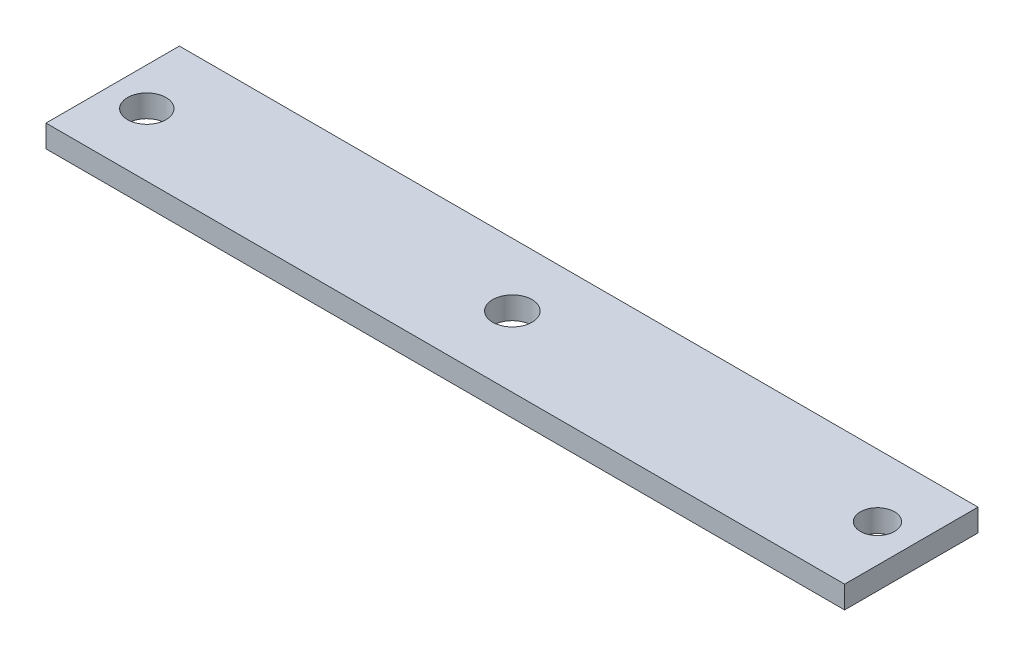
ISO-10303-21;
HEADER;
FILE_DESCRIPTION(('STEP AP214'),'2;1');
FILE_NAME('part.step','',(''),(''),'','','');
FILE_SCHEMA(('AUTOMOTIVE_DESIGN { 1 0 10303 214 1 1 1 1 }'));
ENDSEC;
DATA;
#1=APPLICATION_CONTEXT('core data for automotive mechanical design processes');
#2=APPLICATION_PROTOCOL_DEFINITION('international standard','automotive_design',2000,#1);
#3=PRODUCT_CONTEXT('',#1,'mechanical');
#4=PRODUCT('Part','Part','',(#3));
#5=PRODUCT_RELATED_PRODUCT_CATEGORY('part','',(#4));
#6=PRODUCT_DEFINITION_FORMATION('','',#4);
#7=PRODUCT_DEFINITION_CONTEXT('part definition',#1,'design');
#8=PRODUCT_DEFINITION('design','',#6,#7);
#9=PRODUCT_DEFINITION_SHAPE('','',#8);
#10=(LENGTH_UNIT() NAMED_UNIT(*) SI_UNIT(.MILLI.,.METRE.));
#11=(NAMED_UNIT(*) PLANE_ANGLE_UNIT() SI_UNIT($,.RADIAN.));
#12=(NAMED_UNIT(*) SI_UNIT($,.STERADIAN.) SOLID_ANGLE_UNIT());
#13=UNCERTAINTY_MEASURE_WITH_UNIT(LENGTH_MEASURE(1.E-05),#10,'distance_accuracy_value','');
#14=(GEOMETRIC_REPRESENTATION_CONTEXT(3) GLOBAL_UNCERTAINTY_ASSIGNED_CONTEXT((#13)) GLOBAL_UNIT_ASSIGNED_CONTEXT((#10,
#11,#12)) REPRESENTATION_CONTEXT('',''));
#15=CARTESIAN_POINT('',(0.,0.,0.));
#16=DIRECTION('',(0.,0.,1.));
#17=DIRECTION('',(1.,0.,0.));
#18=AXIS2_PLACEMENT_3D('',#15,#16,#17);
#19=CARTESIAN_POINT('',(0.,2.6,0.));
#20=DIRECTION('',(0.,1.,0.));
#21=DIRECTION('',(0.,0.,1.));
#22=AXIS2_PLACEMENT_3D('',#19,#20,#21);
#23=PLANE('',#22);
#24=CARTESIAN_POINT('',(12.6319444444444,2.6,-1.57020833333333));
#25=DIRECTION('',(0.,1.,0.));
#26=DIRECTION('',(0.,0.,1.));
#27=AXIS2_PLACEMENT_3D('',#24,#25,#26);
#28=CIRCLE('',#27,2.285);
#29=CARTESIAN_POINT('',(12.6319444444444,2.6,0.714791666666672));
#30=VERTEX_POINT('',#29);
#31=EDGE_CURVE('E114',#30,#30,#28,.T.);
#32=ORIENTED_EDGE('',*,*,#31,.F.);
#33=EDGE_LOOP('',(#32));
#34=FACE_BOUND('',#33,.T.);
#35=DIRECTION('',(0.,0.,1.));
#36=VECTOR('',#35,1.);
#37=CARTESIAN_POINT('',(-33.3680555555556,2.6,-8.88020833333333));
#38=LINE('',#37,#36);
#39=CARTESIAN_POINT('',(-33.3680555555556,2.6,-8.88020833333333));
#40=VERTEX_POINT('',#39);
#41=CARTESIAN_POINT('',(-33.3680555555556,2.6,6.61979166666667));
#42=VERTEX_POINT('',#41);
#43=EDGE_CURVE('E84',#40,#42,#38,.T.);
#44=ORIENTED_EDGE('',*,*,#43,.T.);
#45=DIRECTION('',(1.,0.,0.));
#46=VECTOR('',#45,1.);
#47=CARTESIAN_POINT('',(-33.3680555555556,2.6,6.61979166666667));
#48=LINE('',#47,#46);
#49=CARTESIAN_POINT('',(59.4319444444444,2.6,6.61979166666667));
#50=VERTEX_POINT('',#49);
#51=EDGE_CURVE('E79',#42,#50,#48,.T.);
#52=ORIENTED_EDGE('',*,*,#51,.T.);
#53=DIRECTION('',(0.,0.,-1.));
#54=VECTOR('',#53,1.);
#55=CARTESIAN_POINT('',(59.4319444444444,2.6,-8.88020833333333));
#56=LINE('',#55,#54);
#57=CARTESIAN_POINT('',(59.4319444444444,2.6,-8.88020833333333));
#58=VERTEX_POINT('',#57);
#59=EDGE_CURVE('E82',#50,#58,#56,.T.);
#60=ORIENTED_EDGE('',*,*,#59,.T.);
#61=DIRECTION('',(-1.,0.,0.));
#62=VECTOR('',#61,1.);
#63=CARTESIAN_POINT('',(-33.3680555555556,2.6,-8.88020833333333));
#64=LINE('',#63,#62);
#65=EDGE_CURVE('E49',#58,#40,#64,.T.);
#66=ORIENTED_EDGE('',*,*,#65,.T.);
#67=EDGE_LOOP('',(#44,#52,#60,#66));
#68=FACE_BOUND('',#67,.T.);
#69=CARTESIAN_POINT('',(-28.9680555555556,2.6,-0.690208333333329));
#70=DIRECTION('',(0.,1.,0.));
#71=DIRECTION('',(0.,0.,1.));
#72=AXIS2_PLACEMENT_3D('',#69,#70,#71);
#73=CIRCLE('',#72,2.2355);
#74=CARTESIAN_POINT('',(-28.9680555555556,2.6,1.54529166666667));
#75=VERTEX_POINT('',#74);
#76=EDGE_CURVE('E99',#75,#75,#73,.T.);
#77=ORIENTED_EDGE('',*,*,#76,.F.);
#78=EDGE_LOOP('',(#77));
#79=FACE_BOUND('',#78,.T.);
#80=CARTESIAN_POINT('',(55.0519444444444,2.6,-1.58020833333333));
#81=DIRECTION('',(0.,1.,0.));
#82=DIRECTION('',(0.,0.,1.));
#83=AXIS2_PLACEMENT_3D('',#80,#81,#82);
#84=CIRCLE('',#83,1.985);
#85=CARTESIAN_POINT('',(55.0519444444444,2.6,0.404791666666673));
#86=VERTEX_POINT('',#85);
#87=EDGE_CURVE('E120',#86,#86,#84,.T.);
#88=ORIENTED_EDGE('',*,*,#87,.F.);
#89=EDGE_LOOP('',(#88));
#90=FACE_BOUND('',#89,.T.);
#91=ADVANCED_FACE('F32',(#34,#68,#79,#90),#23,.T.);
#92=CARTESIAN_POINT('',(0.,0.,0.));
#93=DIRECTION('',(0.,1.,0.));
#94=DIRECTION('',(0.,0.,1.));
#95=AXIS2_PLACEMENT_3D('',#92,#93,#94);
#96=PLANE('',#95);
#97=DIRECTION('',(0.,0.,1.));
#98=VECTOR('',#97,1.);
#99=CARTESIAN_POINT('',(-33.3680555555556,0.,-8.88020833333333));
#100=LINE('',#99,#98);
#101=CARTESIAN_POINT('',(-33.3680555555556,0.,-8.88020833333333));
#102=VERTEX_POINT('',#101);
#103=CARTESIAN_POINT('',(-33.3680555555556,0.,6.61979166666667));
#104=VERTEX_POINT('',#103);
#105=EDGE_CURVE('E96',#102,#104,#100,.T.);
#106=ORIENTED_EDGE('',*,*,#105,.F.);
#107=DIRECTION('',(-1.,0.,0.));
#108=VECTOR('',#107,1.);
#109=CARTESIAN_POINT('',(-33.3680555555556,0.,-8.88020833333333));
#110=LINE('',#109,#108);
#111=CARTESIAN_POINT('',(59.4319444444444,0.,-8.88020833333333));
#112=VERTEX_POINT('',#111);
#113=EDGE_CURVE('E72',#112,#102,#110,.T.);
#114=ORIENTED_EDGE('',*,*,#113,.F.);
#115=DIRECTION('',(0.,0.,-1.));
#116=VECTOR('',#115,1.);
#117=CARTESIAN_POINT('',(59.4319444444444,0.,-8.88020833333333));
#118=LINE('',#117,#116);
#119=CARTESIAN_POINT('',(59.4319444444444,0.,6.61979166666667));
#120=VERTEX_POINT('',#119);
#121=EDGE_CURVE('E66',#120,#112,#118,.T.);
#122=ORIENTED_EDGE('',*,*,#121,.F.);
#123=DIRECTION('',(1.,0.,0.));
#124=VECTOR('',#123,1.);
#125=CARTESIAN_POINT('',(-33.3680555555556,0.,6.61979166666667));
#126=LINE('',#125,#124);
#127=EDGE_CURVE('E88',#104,#120,#126,.T.);
#128=ORIENTED_EDGE('',*,*,#127,.F.);
#129=EDGE_LOOP('',(#106,#114,#122,#128));
#130=FACE_BOUND('',#129,.T.);
#131=CARTESIAN_POINT('',(-28.9680555555556,0.,-0.690208333333329));
#132=DIRECTION('',(0.,1.,0.));
#133=DIRECTION('',(0.,0.,1.));
#134=AXIS2_PLACEMENT_3D('',#131,#132,#133);
#135=CIRCLE('',#134,2.2355);
#136=CARTESIAN_POINT('',(-28.9680555555556,0.,1.54529166666667));
#137=VERTEX_POINT('',#136);
#138=EDGE_CURVE('E111',#137,#137,#135,.T.);
#139=ORIENTED_EDGE('',*,*,#138,.T.);
#140=EDGE_LOOP('',(#139));
#141=FACE_BOUND('',#140,.T.);
#142=CARTESIAN_POINT('',(12.6319444444444,0.,-1.57020833333333));
#143=DIRECTION('',(0.,1.,0.));
#144=DIRECTION('',(0.,0.,1.));
#145=AXIS2_PLACEMENT_3D('',#142,#143,#144);
#146=CIRCLE('',#145,2.285);
#147=CARTESIAN_POINT('',(12.6319444444444,0.,0.714791666666672));
#148=VERTEX_POINT('',#147);
#149=EDGE_CURVE('E117',#148,#148,#146,.T.);
#150=ORIENTED_EDGE('',*,*,#149,.T.);
#151=EDGE_LOOP('',(#150));
#152=FACE_BOUND('',#151,.T.);
#153=CARTESIAN_POINT('',(55.0519444444444,0.,-1.58020833333333));
#154=DIRECTION('',(0.,1.,0.));
#155=DIRECTION('',(0.,0.,1.));
#156=AXIS2_PLACEMENT_3D('',#153,#154,#155);
#157=CIRCLE('',#156,1.985);
#158=CARTESIAN_POINT('',(55.0519444444444,0.,0.404791666666673));
#159=VERTEX_POINT('',#158);
#160=EDGE_CURVE('E123',#159,#159,#157,.T.);
#161=ORIENTED_EDGE('',*,*,#160,.T.);
#162=EDGE_LOOP('',(#161));
#163=FACE_BOUND('',#162,.T.);
#164=ADVANCED_FACE('F107',(#130,#141,#152,#163),#96,.F.);
#165=CARTESIAN_POINT('',(-33.3680555555556,2.6,-8.88020833333333));
#166=DIRECTION('',(1.,0.,0.));
#167=DIRECTION('',(0.,0.,-1.));
#168=AXIS2_PLACEMENT_3D('',#165,#166,#167);
#169=PLANE('',#168);
#170=ORIENTED_EDGE('',*,*,#105,.T.);
#171=DIRECTION('',(0.,-1.,0.));
#172=VECTOR('',#171,1.);
#173=CARTESIAN_POINT('',(-33.3680555555556,2.6,6.61979166666667));
#174=LINE('',#173,#172);
#175=EDGE_CURVE('E11',#42,#104,#174,.T.);
#176=ORIENTED_EDGE('',*,*,#175,.F.);
#177=ORIENTED_EDGE('',*,*,#43,.F.);
#178=DIRECTION('',(0.,-1.,0.));
#179=VECTOR('',#178,1.);
#180=CARTESIAN_POINT('',(-33.3680555555556,2.6,-8.88020833333333));
#181=LINE('',#180,#179);
#182=EDGE_CURVE('E92',#40,#102,#181,.T.);
#183=ORIENTED_EDGE('',*,*,#182,.T.);
#184=EDGE_LOOP('',(#170,#176,#177,#183));
#185=FACE_BOUND('',#184,.T.);
#186=ADVANCED_FACE('F34',(#185),#169,.F.);
#187=CARTESIAN_POINT('',(-33.3680555555556,2.6,6.61979166666667));
#188=DIRECTION('',(0.,0.,-1.));
#189=DIRECTION('',(-1.,0.,0.));
#190=AXIS2_PLACEMENT_3D('',#187,#188,#189);
#191=PLANE('',#190);
#192=ORIENTED_EDGE('',*,*,#127,.T.);
#193=DIRECTION('',(0.,-1.,0.));
#194=VECTOR('',#193,1.);
#195=CARTESIAN_POINT('',(59.4319444444444,2.6,6.61979166666667));
#196=LINE('',#195,#194);
#197=EDGE_CURVE('E41',#50,#120,#196,.T.);
#198=ORIENTED_EDGE('',*,*,#197,.F.);
#199=ORIENTED_EDGE('',*,*,#51,.F.);
#200=ORIENTED_EDGE('',*,*,#175,.T.);
#201=EDGE_LOOP('',(#192,#198,#199,#200));
#202=FACE_BOUND('',#201,.T.);
#203=ADVANCED_FACE('F87',(#202),#191,.F.);
#204=CARTESIAN_POINT('',(59.4319444444444,2.6,-8.88020833333333));
#205=DIRECTION('',(-1.,0.,0.));
#206=DIRECTION('',(0.,0.,1.));
#207=AXIS2_PLACEMENT_3D('',#204,#205,#206);
#208=PLANE('',#207);
#209=ORIENTED_EDGE('',*,*,#121,.T.);
#210=DIRECTION('',(0.,-1.,0.));
#211=VECTOR('',#210,1.);
#212=CARTESIAN_POINT('',(59.4319444444444,2.6,-8.88020833333333));
#213=LINE('',#212,#211);
#214=EDGE_CURVE('E89',#58,#112,#213,.T.);
#215=ORIENTED_EDGE('',*,*,#214,.F.);
#216=ORIENTED_EDGE('',*,*,#59,.F.);
#217=ORIENTED_EDGE('',*,*,#197,.T.);
#218=EDGE_LOOP('',(#209,#215,#216,#217));
#219=FACE_BOUND('',#218,.T.);
#220=ADVANCED_FACE('F90',(#219),#208,.F.);
#221=CARTESIAN_POINT('',(-33.3680555555556,2.6,-8.88020833333333));
#222=DIRECTION('',(0.,0.,1.));
#223=DIRECTION('',(1.,0.,0.));
#224=AXIS2_PLACEMENT_3D('',#221,#222,#223);
#225=PLANE('',#224);
#226=ORIENTED_EDGE('',*,*,#113,.T.);
#227=ORIENTED_EDGE('',*,*,#182,.F.);
#228=ORIENTED_EDGE('',*,*,#65,.F.);
#229=ORIENTED_EDGE('',*,*,#214,.T.);
#230=EDGE_LOOP('',(#226,#227,#228,#229));
#231=FACE_BOUND('',#230,.T.);
#232=ADVANCED_FACE('F104',(#231),#225,.F.);
#233=CARTESIAN_POINT('',(-28.9680555555556,2.6,-0.690208333333329));
#234=DIRECTION('',(0.,-1.,0.));
#235=DIRECTION('',(0.,0.,-1.));
#236=AXIS2_PLACEMENT_3D('',#233,#234,#235);
#237=CYLINDRICAL_SURFACE('',#236,2.2355);
#238=ORIENTED_EDGE('',*,*,#76,.T.);
#239=EDGE_LOOP('',(#238));
#240=FACE_BOUND('',#239,.T.);
#241=ORIENTED_EDGE('',*,*,#138,.F.);
#242=EDGE_LOOP('',(#241));
#243=FACE_BOUND('',#242,.T.);
#244=ADVANCED_FACE('F141',(#240,#243),#237,.F.);
#245=CARTESIAN_POINT('',(12.6319444444444,2.6,-1.57020833333333));
#246=DIRECTION('',(0.,-1.,0.));
#247=DIRECTION('',(0.,0.,-1.));
#248=AXIS2_PLACEMENT_3D('',#245,#246,#247);
#249=CYLINDRICAL_SURFACE('',#248,2.285);
#250=ORIENTED_EDGE('',*,*,#31,.T.);
#251=EDGE_LOOP('',(#250));
#252=FACE_BOUND('',#251,.T.);
#253=ORIENTED_EDGE('',*,*,#149,.F.);
#254=EDGE_LOOP('',(#253));
#255=FACE_BOUND('',#254,.T.);
#256=ADVANCED_FACE('F187',(#252,#255),#249,.F.);
#257=CARTESIAN_POINT('',(55.0519444444444,2.6,-1.58020833333333));
#258=DIRECTION('',(0.,-1.,0.));
#259=DIRECTION('',(0.,0.,-1.));
#260=AXIS2_PLACEMENT_3D('',#257,#258,#259);
#261=CYLINDRICAL_SURFACE('',#260,1.985);
#262=ORIENTED_EDGE('',*,*,#87,.T.);
#263=EDGE_LOOP('',(#262));
#264=FACE_BOUND('',#263,.T.);
#265=ORIENTED_EDGE('',*,*,#160,.F.);
#266=EDGE_LOOP('',(#265));
#267=FACE_BOUND('',#266,.T.);
#268=ADVANCED_FACE('F129',(#264,#267),#261,.F.);
#269=CLOSED_SHELL('',(#91,#164,#186,#203,#220,#232,#244,#256,#268));
#270=MANIFOLD_SOLID_BREP('B2',#269);
#271=ADVANCED_BREP_SHAPE_REPRESENTATION('',(#18,#270),#14);
#272=SHAPE_DEFINITION_REPRESENTATION(#9,#271);
ENDSEC;
END-ISO-10303-21;
